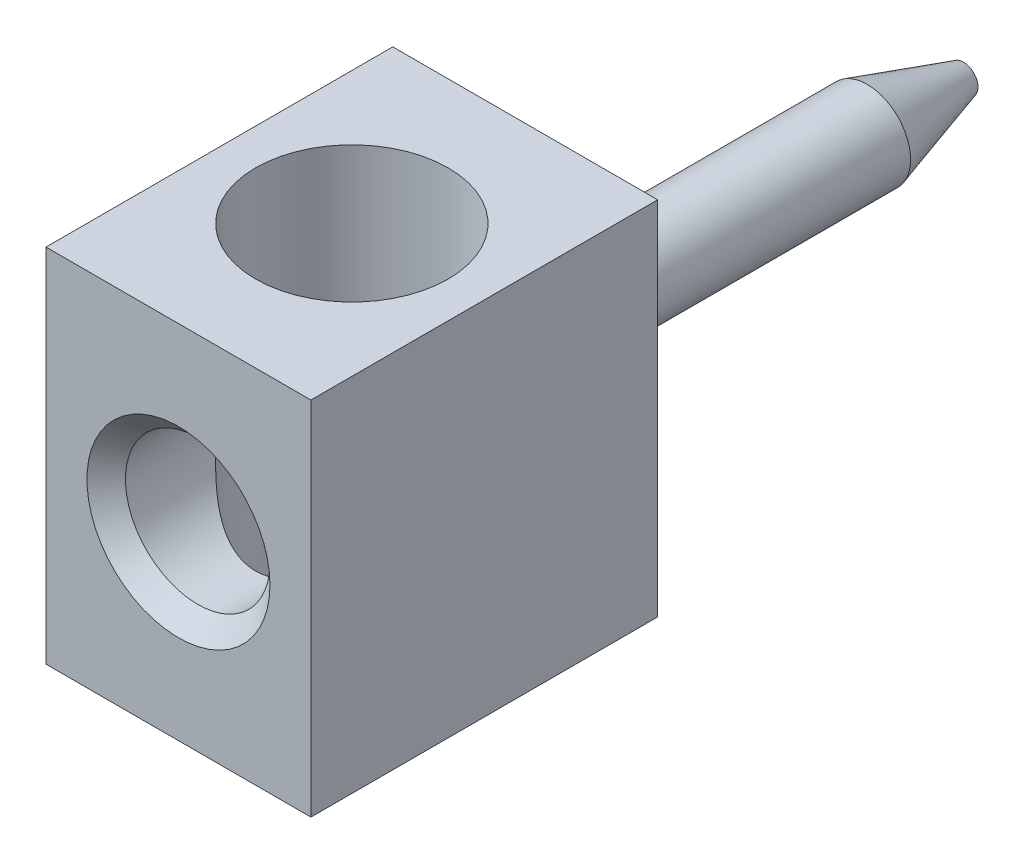
ISO-10303-21;
HEADER;
FILE_DESCRIPTION(('STEP AP214'),'2;1');
FILE_NAME('part.step','',(''),(''),'','','');
FILE_SCHEMA(('AUTOMOTIVE_DESIGN { 1 0 10303 214 1 1 1 1 }'));
ENDSEC;
DATA;
#1=APPLICATION_CONTEXT('core data for automotive mechanical design processes');
#2=APPLICATION_PROTOCOL_DEFINITION('international standard','automotive_design',2000,#1);
#3=PRODUCT_CONTEXT('',#1,'mechanical');
#4=PRODUCT('Part','Part','',(#3));
#5=PRODUCT_RELATED_PRODUCT_CATEGORY('part','',(#4));
#6=PRODUCT_DEFINITION_FORMATION('','',#4);
#7=PRODUCT_DEFINITION_CONTEXT('part definition',#1,'design');
#8=PRODUCT_DEFINITION('design','',#6,#7);
#9=PRODUCT_DEFINITION_SHAPE('','',#8);
#10=(LENGTH_UNIT() NAMED_UNIT(*) SI_UNIT(.MILLI.,.METRE.));
#11=(NAMED_UNIT(*) PLANE_ANGLE_UNIT() SI_UNIT($,.RADIAN.));
#12=(NAMED_UNIT(*) SI_UNIT($,.STERADIAN.) SOLID_ANGLE_UNIT());
#13=UNCERTAINTY_MEASURE_WITH_UNIT(LENGTH_MEASURE(1.E-05),#10,'distance_accuracy_value','');
#14=(GEOMETRIC_REPRESENTATION_CONTEXT(3) GLOBAL_UNCERTAINTY_ASSIGNED_CONTEXT((#13)) GLOBAL_UNIT_ASSIGNED_CONTEXT((#10,
#11,#12)) REPRESENTATION_CONTEXT('',''));
#15=CARTESIAN_POINT('',(0.,0.,0.));
#16=DIRECTION('',(0.,0.,1.));
#17=DIRECTION('',(1.,0.,0.));
#18=AXIS2_PLACEMENT_3D('',#15,#16,#17);
#19=CARTESIAN_POINT('',(0.,0.,-6.35));
#20=DIRECTION('',(0.,0.,1.));
#21=DIRECTION('',(1.,0.,0.));
#22=AXIS2_PLACEMENT_3D('',#19,#20,#21);
#23=PLANE('',#22);
#24=CARTESIAN_POINT('',(0.,0.,-6.34999999999764));
#25=DIRECTION('',(0.,0.,1.));
#26=DIRECTION('',(1.,0.,0.));
#27=AXIS2_PLACEMENT_3D('',#24,#25,#26);
#28=CIRCLE('',#27,0.149999999990768);
#29=CARTESIAN_POINT('',(0.149999999990768,0.,-6.34999999999764));
#30=VERTEX_POINT('',#29);
#31=EDGE_CURVE('E20',#30,#30,#28,.T.);
#32=ORIENTED_EDGE('',*,*,#31,.F.);
#33=EDGE_LOOP('',(#32));
#34=FACE_BOUND('',#33,.T.);
#35=ADVANCED_FACE('F17',(#34),#23,.F.);
#36=CARTESIAN_POINT('',(0.,0.,-5.35000000002128));
#37=DIRECTION('',(0.,0.,1.));
#38=DIRECTION('',(1.,0.,0.));
#39=AXIS2_PLACEMENT_3D('',#36,#37,#38);
#40=CONICAL_SURFACE('',#39,0.449999999972305,0.291456794467437);
#41=CARTESIAN_POINT('',(0.,0.,-5.35));
#42=DIRECTION('',(0.,0.,1.));
#43=DIRECTION('',(1.,0.,0.));
#44=AXIS2_PLACEMENT_3D('',#41,#42,#43);
#45=CIRCLE('',#44,0.45);
#46=CARTESIAN_POINT('',(0.449999999978691,0.,-5.35));
#47=VERTEX_POINT('',#46);
#48=EDGE_CURVE('E90',#47,#47,#45,.T.);
#49=CARTESIAN_POINT('',(0.449999999978691,0.,-5.35));
#50=CARTESIAN_POINT('',(0.446874999978817,0.,-5.36041666666664));
#51=CARTESIAN_POINT('',(0.443749999978942,0.,-5.37083333333328));
#52=CARTESIAN_POINT('',(0.437499999979194,0.,-5.39166666666657));
#53=CARTESIAN_POINT('',(0.43437499997932,0.,-5.40208333333321));
#54=CARTESIAN_POINT('',(0.428124999979571,0.,-5.42291666666649));
#55=CARTESIAN_POINT('',(0.424999999979697,0.,-5.43333333333314));
#56=CARTESIAN_POINT('',(0.418749999979949,0.,-5.45416666666642));
#57=CARTESIAN_POINT('',(0.415624999980075,0.,-5.46458333333306));
#58=CARTESIAN_POINT('',(0.409374999980326,0.,-5.48541666666635));
#59=CARTESIAN_POINT('',(0.406249999980452,0.,-5.49583333333299));
#60=CARTESIAN_POINT('',(0.399999999980704,0.,-5.51666666666627));
#61=CARTESIAN_POINT('',(0.396874999980829,0.,-5.52708333333291));
#62=CARTESIAN_POINT('',(0.390624999981081,0.,-5.5479166666662));
#63=CARTESIAN_POINT('',(0.387499999981207,0.,-5.55833333333284));
#64=CARTESIAN_POINT('',(0.381249999981459,0.,-5.57916666666612));
#65=CARTESIAN_POINT('',(0.378124999981584,0.,-5.58958333333277));
#66=CARTESIAN_POINT('',(0.371874999981836,0.,-5.61041666666605));
#67=CARTESIAN_POINT('',(0.368749999981962,0.,-5.62083333333269));
#68=CARTESIAN_POINT('',(0.362499999982213,0.,-5.64166666666598));
#69=CARTESIAN_POINT('',(0.359374999982339,0.,-5.65208333333262));
#70=CARTESIAN_POINT('',(0.353124999982591,0.,-5.6729166666659));
#71=CARTESIAN_POINT('',(0.349999999982717,0.,-5.68333333333254));
#72=CARTESIAN_POINT('',(0.343749999982968,0.,-5.70416666666583));
#73=CARTESIAN_POINT('',(0.340624999983094,0.,-5.71458333333247));
#74=CARTESIAN_POINT('',(0.334374999983346,0.,-5.73541666666575));
#75=CARTESIAN_POINT('',(0.331249999983471,0.,-5.7458333333324));
#76=CARTESIAN_POINT('',(0.324999999983723,0.,-5.76666666666568));
#77=CARTESIAN_POINT('',(0.321874999983849,0.,-5.77708333333232));
#78=CARTESIAN_POINT('',(0.315624999984101,0.,-5.79791666666561));
#79=CARTESIAN_POINT('',(0.312499999984226,0.,-5.80833333333225));
#80=CARTESIAN_POINT('',(0.306249999984478,0.,-5.82916666666553));
#81=CARTESIAN_POINT('',(0.303124999984604,0.,-5.83958333333218));
#82=CARTESIAN_POINT('',(0.296874999984855,0.,-5.86041666666546));
#83=CARTESIAN_POINT('',(0.293749999984981,0.,-5.8708333333321));
#84=CARTESIAN_POINT('',(0.287499999985233,0.,-5.89166666666539));
#85=CARTESIAN_POINT('',(0.284374999985359,0.,-5.90208333333203));
#86=CARTESIAN_POINT('',(0.27812499998561,0.,-5.92291666666531));
#87=CARTESIAN_POINT('',(0.274999999985736,0.,-5.93333333333195));
#88=CARTESIAN_POINT('',(0.268749999985988,0.,-5.95416666666524));
#89=CARTESIAN_POINT('',(0.265624999986113,0.,-5.96458333333188));
#90=CARTESIAN_POINT('',(0.259374999986365,0.,-5.98541666666516));
#91=CARTESIAN_POINT('',(0.256249999986491,0.,-5.99583333333181));
#92=CARTESIAN_POINT('',(0.249999999986743,0.,-6.01666666666509));
#93=CARTESIAN_POINT('',(0.246874999986868,0.,-6.02708333333173));
#94=CARTESIAN_POINT('',(0.24062499998712,0.,-6.04791666666502));
#95=CARTESIAN_POINT('',(0.237499999987246,0.,-6.05833333333166));
#96=CARTESIAN_POINT('',(0.231249999987497,0.,-6.07916666666494));
#97=CARTESIAN_POINT('',(0.228124999987623,0.,-6.08958333333158));
#98=CARTESIAN_POINT('',(0.221874999987875,0.,-6.11041666666487));
#99=CARTESIAN_POINT('',(0.218749999988001,0.,-6.12083333333151));
#100=CARTESIAN_POINT('',(0.212499999988252,0.,-6.1416666666648));
#101=CARTESIAN_POINT('',(0.209374999988378,0.,-6.15208333333144));
#102=CARTESIAN_POINT('',(0.20312499998863,0.,-6.17291666666472));
#103=CARTESIAN_POINT('',(0.199999999988755,0.,-6.18333333333136));
#104=CARTESIAN_POINT('',(0.193749999989007,0.,-6.20416666666465));
#105=CARTESIAN_POINT('',(0.190624999989133,0.,-6.21458333333129));
#106=CARTESIAN_POINT('',(0.184374999989385,0.,-6.23541666666457));
#107=CARTESIAN_POINT('',(0.18124999998951,0.,-6.24583333333122));
#108=CARTESIAN_POINT('',(0.174999999989762,0.,-6.2666666666645));
#109=CARTESIAN_POINT('',(0.171874999989888,0.,-6.27708333333114));
#110=CARTESIAN_POINT('',(0.165624999990139,0.,-6.29791666666443));
#111=CARTESIAN_POINT('',(0.162499999990265,0.,-6.30833333333107));
#112=CARTESIAN_POINT('',(0.156249999990517,0.,-6.32916666666435));
#113=CARTESIAN_POINT('',(0.153124999990643,0.,-6.33958333333099));
#114=CARTESIAN_POINT('',(0.149999999990768,0.,-6.34999999999764));
#115=B_SPLINE_CURVE_WITH_KNOTS('',3,(#49,#50,#51,#52,#53,#54,#55,#56,#57,#58,#59,#60,#61,#62,
#63,#64,#65,#66,#67,#68,#69,#70,#71,#72,#73,#74,#75,#76,#77,#78,#79,#80,#81,#82,#83,#84,#85,#86,
#87,#88,#89,#90,#91,#92,#93,#94,#95,#96,#97,#98,#99,#100,#101,#102,#103,#104,#105,#106,#107,
#108,#109,#110,#111,#112,#113,#114),.UNSPECIFIED.,.F.,.F.,(4,2,2,2,2,2,2,2,2,2,2,2,2,2,2,2,2,2,
2,2,2,2,2,2,2,2,2,2,2,2,2,2,4),(0.,0.0326259578401664,0.0652519156803329,0.0978778735204993,
0.130503831360666,0.163129789200832,0.195755747040998,0.228381704881164,0.261007662721331,
0.293633620561497,0.326259578401663,0.358885536241829,0.391511494081995,0.424137451922162,
0.456763409762328,0.489389367602495,0.522015325442661,0.554641283282827,0.587267241122993,
0.61989319896316,0.652519156803326,0.685145114643493,0.717771072483658,0.750397030323825,
0.783022988163991,0.815648946004157,0.848274903844324,0.880900861684489,0.913526819524656,
0.946152777364822,0.978778735204989,1.01140469304516,1.04403065088532),.UNSPECIFIED.);
#116=EDGE_CURVE('BSEAM133',#47,#30,#115,.T.);
#117=ORIENTED_EDGE('',*,*,#48,.F.);
#118=ORIENTED_EDGE('',*,*,#31,.T.);
#119=ORIENTED_EDGE('',*,*,#116,.T.);
#120=ORIENTED_EDGE('',*,*,#116,.F.);
#121=EDGE_LOOP('',(#117,#119,#118,#120));
#122=FACE_BOUND('',#121,.T.);
#123=ADVANCED_FACE('F133',(#122),#40,.T.);
#124=CARTESIAN_POINT('',(0.,0.,-6.35));
#125=DIRECTION('',(0.,0.,1.));
#126=DIRECTION('',(1.,0.,0.));
#127=AXIS2_PLACEMENT_3D('',#124,#125,#126);
#128=CYLINDRICAL_SURFACE('',#127,0.45);
#129=CARTESIAN_POINT('',(0.,0.,-1.8));
#130=DIRECTION('',(0.,0.,1.));
#131=DIRECTION('',(1.,0.,0.));
#132=AXIS2_PLACEMENT_3D('',#129,#130,#131);
#133=CIRCLE('',#132,0.45);
#134=CARTESIAN_POINT('',(0.45,0.,-1.8));
#135=VERTEX_POINT('',#134);
#136=EDGE_CURVE('E89',#135,#135,#133,.T.);
#137=ORIENTED_EDGE('',*,*,#136,.F.);
#138=EDGE_LOOP('',(#137));
#139=FACE_BOUND('',#138,.T.);
#140=ORIENTED_EDGE('',*,*,#48,.T.);
#141=EDGE_LOOP('',(#140));
#142=FACE_BOUND('',#141,.T.);
#143=ADVANCED_FACE('F129',(#139,#142),#128,.T.);
#144=CARTESIAN_POINT('',(1.375,-1.875,1.8));
#145=DIRECTION('',(1.,0.,0.));
#146=DIRECTION('',(0.,0.,-1.));
#147=AXIS2_PLACEMENT_3D('',#144,#145,#146);
#148=PLANE('',#147);
#149=DIRECTION('',(0.,0.,1.));
#150=VECTOR('',#149,1.);
#151=CARTESIAN_POINT('',(1.375,-1.875,0.));
#152=LINE('',#151,#150);
#153=CARTESIAN_POINT('',(1.375,-1.875,1.8));
#154=VERTEX_POINT('',#153);
#155=CARTESIAN_POINT('',(1.375,-1.875,-1.8));
#156=VERTEX_POINT('',#155);
#157=EDGE_CURVE('E300',#154,#156,#152,.F.);
#158=ORIENTED_EDGE('',*,*,#157,.T.);
#159=DIRECTION('',(0.,1.,0.));
#160=VECTOR('',#159,1.);
#161=CARTESIAN_POINT('',(1.375,-1.875,-1.8));
#162=LINE('',#161,#160);
#163=CARTESIAN_POINT('',(1.375,1.875,-1.8));
#164=VERTEX_POINT('',#163);
#165=EDGE_CURVE('E56',#164,#156,#162,.F.);
#166=ORIENTED_EDGE('',*,*,#165,.F.);
#167=DIRECTION('',(0.,0.,1.));
#168=VECTOR('',#167,1.);
#169=CARTESIAN_POINT('',(1.375,1.875,0.));
#170=LINE('',#169,#168);
#171=CARTESIAN_POINT('',(1.375,1.875,1.8));
#172=VERTEX_POINT('',#171);
#173=EDGE_CURVE('E301',#172,#164,#170,.F.);
#174=ORIENTED_EDGE('',*,*,#173,.F.);
#175=DIRECTION('',(0.,1.,0.));
#176=VECTOR('',#175,1.);
#177=CARTESIAN_POINT('',(1.375,-1.875,1.8));
#178=LINE('',#177,#176);
#179=EDGE_CURVE('E82',#154,#172,#178,.T.);
#180=ORIENTED_EDGE('',*,*,#179,.F.);
#181=EDGE_LOOP('',(#158,#166,#174,#180));
#182=FACE_BOUND('',#181,.T.);
#183=ADVANCED_FACE('F132',(#182),#148,.T.);
#184=CARTESIAN_POINT('',(1.375,-1.875,-1.8));
#185=DIRECTION('',(0.,0.,-1.));
#186=DIRECTION('',(-1.,0.,0.));
#187=AXIS2_PLACEMENT_3D('',#184,#185,#186);
#188=PLANE('',#187);
#189=DIRECTION('',(1.,0.,0.));
#190=VECTOR('',#189,1.);
#191=CARTESIAN_POINT('',(0.,-1.875,-1.8));
#192=LINE('',#191,#190);
#193=CARTESIAN_POINT('',(-1.375,-1.875,-1.8));
#194=VERTEX_POINT('',#193);
#195=EDGE_CURVE('E72',#156,#194,#192,.F.);
#196=ORIENTED_EDGE('',*,*,#195,.T.);
#197=DIRECTION('',(0.,1.,0.));
#198=VECTOR('',#197,1.);
#199=CARTESIAN_POINT('',(-1.375,-1.875,-1.8));
#200=LINE('',#199,#198);
#201=CARTESIAN_POINT('',(-1.375,1.875,-1.8));
#202=VERTEX_POINT('',#201);
#203=EDGE_CURVE('E62',#202,#194,#200,.F.);
#204=ORIENTED_EDGE('',*,*,#203,.F.);
#205=DIRECTION('',(1.,0.,0.));
#206=VECTOR('',#205,1.);
#207=CARTESIAN_POINT('',(0.,1.875,-1.8));
#208=LINE('',#207,#206);
#209=EDGE_CURVE('E305',#164,#202,#208,.F.);
#210=ORIENTED_EDGE('',*,*,#209,.F.);
#211=ORIENTED_EDGE('',*,*,#165,.T.);
#212=EDGE_LOOP('',(#196,#204,#210,#211));
#213=FACE_BOUND('',#212,.T.);
#214=ORIENTED_EDGE('',*,*,#136,.T.);
#215=EDGE_LOOP('',(#214));
#216=FACE_BOUND('',#215,.T.);
#217=ADVANCED_FACE('F77',(#213,#216),#188,.T.);
#218=CARTESIAN_POINT('',(-1.375,-1.875,-1.8));
#219=DIRECTION('',(-1.,0.,0.));
#220=DIRECTION('',(0.,0.,1.));
#221=AXIS2_PLACEMENT_3D('',#218,#219,#220);
#222=PLANE('',#221);
#223=DIRECTION('',(0.,0.,1.));
#224=VECTOR('',#223,1.);
#225=CARTESIAN_POINT('',(-1.375,-1.875,0.));
#226=LINE('',#225,#224);
#227=CARTESIAN_POINT('',(-1.375,-1.875,1.8));
#228=VERTEX_POINT('',#227);
#229=EDGE_CURVE('E65',#194,#228,#226,.T.);
#230=ORIENTED_EDGE('',*,*,#229,.T.);
#231=DIRECTION('',(0.,1.,0.));
#232=VECTOR('',#231,1.);
#233=CARTESIAN_POINT('',(-1.375,-1.875,1.8));
#234=LINE('',#233,#232);
#235=CARTESIAN_POINT('',(-1.375,1.875,1.8));
#236=VERTEX_POINT('',#235);
#237=EDGE_CURVE('E66',#236,#228,#234,.F.);
#238=ORIENTED_EDGE('',*,*,#237,.F.);
#239=DIRECTION('',(0.,0.,1.));
#240=VECTOR('',#239,1.);
#241=CARTESIAN_POINT('',(-1.375,1.875,0.));
#242=LINE('',#241,#240);
#243=EDGE_CURVE('E35',#202,#236,#242,.T.);
#244=ORIENTED_EDGE('',*,*,#243,.F.);
#245=ORIENTED_EDGE('',*,*,#203,.T.);
#246=EDGE_LOOP('',(#230,#238,#244,#245));
#247=FACE_BOUND('',#246,.T.);
#248=ADVANCED_FACE('F64',(#247),#222,.T.);
#249=CARTESIAN_POINT('',(-1.375,-1.875,1.8));
#250=DIRECTION('',(0.,0.,1.));
#251=DIRECTION('',(1.,0.,0.));
#252=AXIS2_PLACEMENT_3D('',#249,#250,#251);
#253=PLANE('',#252);
#254=DIRECTION('',(1.,0.,0.));
#255=VECTOR('',#254,1.);
#256=CARTESIAN_POINT('',(0.,-1.875,1.8));
#257=LINE('',#256,#255);
#258=EDGE_CURVE('E75',#228,#154,#257,.T.);
#259=ORIENTED_EDGE('',*,*,#258,.T.);
#260=ORIENTED_EDGE('',*,*,#179,.T.);
#261=DIRECTION('',(1.,0.,0.));
#262=VECTOR('',#261,1.);
#263=CARTESIAN_POINT('',(0.,1.875,1.8));
#264=LINE('',#263,#262);
#265=EDGE_CURVE('E124',#236,#172,#264,.T.);
#266=ORIENTED_EDGE('',*,*,#265,.F.);
#267=ORIENTED_EDGE('',*,*,#237,.T.);
#268=EDGE_LOOP('',(#259,#260,#266,#267));
#269=FACE_BOUND('',#268,.T.);
#270=CARTESIAN_POINT('',(0.,0.,1.80000000000291));
#271=DIRECTION('',(0.,0.,1.));
#272=DIRECTION('',(1.,0.,0.));
#273=AXIS2_PLACEMENT_3D('',#270,#271,#272);
#274=CIRCLE('',#273,0.949999999988904);
#275=CARTESIAN_POINT('',(0.949999999988903,0.,1.80000000000291));
#276=VERTEX_POINT('',#275);
#277=EDGE_CURVE('E79',#276,#276,#274,.F.);
#278=ORIENTED_EDGE('',*,*,#277,.T.);
#279=EDGE_LOOP('',(#278));
#280=FACE_BOUND('',#279,.T.);
#281=ADVANCED_FACE('F174',(#269,#280),#253,.T.);
#282=CARTESIAN_POINT('',(0.,0.,1.80000000000291));
#283=DIRECTION('',(0.,0.,1.));
#284=DIRECTION('',(1.,0.,0.));
#285=AXIS2_PLACEMENT_3D('',#282,#283,#284);
#286=CONICAL_SURFACE('',#285,0.949999999988905,0.785398163397448);
#287=ORIENTED_EDGE('',*,*,#277,.F.);
#288=EDGE_LOOP('',(#287));
#289=FACE_BOUND('',#288,.T.);
#290=CARTESIAN_POINT('',(0.,0.,1.6));
#291=DIRECTION('',(0.,0.,1.));
#292=DIRECTION('',(1.,0.,0.));
#293=AXIS2_PLACEMENT_3D('',#290,#291,#292);
#294=CIRCLE('',#293,0.75);
#295=CARTESIAN_POINT('',(0.749999999999999,0.,1.6));
#296=VERTEX_POINT('',#295);
#297=EDGE_CURVE('E122',#296,#296,#294,.F.);
#298=ORIENTED_EDGE('',*,*,#297,.T.);
#299=EDGE_LOOP('',(#298));
#300=FACE_BOUND('',#299,.T.);
#301=ADVANCED_FACE('F181',(#289,#300),#286,.F.);
#302=CARTESIAN_POINT('',(0.,-1.875,0.));
#303=DIRECTION('',(0.,1.,0.));
#304=DIRECTION('',(0.,0.,1.));
#305=AXIS2_PLACEMENT_3D('',#302,#303,#304);
#306=PLANE('',#305);
#307=CARTESIAN_POINT('',(0.,-1.875,0.));
#308=DIRECTION('',(0.,-1.,0.));
#309=DIRECTION('',(0.,0.,-1.));
#310=AXIS2_PLACEMENT_3D('',#307,#308,#309);
#311=CIRCLE('',#310,1.);
#312=CARTESIAN_POINT('',(0.,-1.875,-1.));
#313=VERTEX_POINT('',#312);
#314=EDGE_CURVE('E120',#313,#313,#311,.F.);
#315=ORIENTED_EDGE('',*,*,#314,.T.);
#316=EDGE_LOOP('',(#315));
#317=FACE_BOUND('',#316,.T.);
#318=ORIENTED_EDGE('',*,*,#258,.F.);
#319=ORIENTED_EDGE('',*,*,#229,.F.);
#320=ORIENTED_EDGE('',*,*,#195,.F.);
#321=ORIENTED_EDGE('',*,*,#157,.F.);
#322=EDGE_LOOP('',(#318,#319,#320,#321));
#323=FACE_BOUND('',#322,.T.);
#324=ADVANCED_FACE('F70',(#317,#323),#306,.F.);
#325=CARTESIAN_POINT('',(0.,1.875,0.));
#326=DIRECTION('',(0.,1.,0.));
#327=DIRECTION('',(0.,0.,1.));
#328=AXIS2_PLACEMENT_3D('',#325,#326,#327);
#329=PLANE('',#328);
#330=CARTESIAN_POINT('',(0.,1.875,0.));
#331=DIRECTION('',(0.,-1.,0.));
#332=DIRECTION('',(0.,0.,-1.));
#333=AXIS2_PLACEMENT_3D('',#330,#331,#332);
#334=CIRCLE('',#333,1.);
#335=CARTESIAN_POINT('',(0.,1.875,-1.));
#336=VERTEX_POINT('',#335);
#337=EDGE_CURVE('E26',#336,#336,#334,.T.);
#338=ORIENTED_EDGE('',*,*,#337,.T.);
#339=EDGE_LOOP('',(#338));
#340=FACE_BOUND('',#339,.T.);
#341=ORIENTED_EDGE('',*,*,#243,.T.);
#342=ORIENTED_EDGE('',*,*,#265,.T.);
#343=ORIENTED_EDGE('',*,*,#173,.T.);
#344=ORIENTED_EDGE('',*,*,#209,.T.);
#345=EDGE_LOOP('',(#341,#342,#343,#344));
#346=FACE_BOUND('',#345,.T.);
#347=ADVANCED_FACE('F111',(#340,#346),#329,.T.);
#348=CARTESIAN_POINT('',(0.,0.,-7.583362936602));
#349=DIRECTION('',(0.,0.,1.));
#350=DIRECTION('',(1.,0.,0.));
#351=AXIS2_PLACEMENT_3D('',#348,#349,#350);
#352=CYLINDRICAL_SURFACE('',#351,0.75);
#353=CARTESIAN_POINT('',(0.749883848426441,0.0131990101579515,0.661569507965074));
#354=CARTESIAN_POINT('',(0.750484620605992,-0.0211968194496873,0.660892931706871));
#355=CARTESIAN_POINT('',(0.748699929914007,-0.0557334692623203,0.662941130820464));
#356=CARTESIAN_POINT('',(0.740540882571068,-0.123603785281289,0.672035188662263));
#357=CARTESIAN_POINT('',(0.734153955631906,-0.15693389359248,0.67909473431332));
#358=CARTESIAN_POINT('',(0.717443666832934,-0.22104030332036,0.696719362761739));
#359=CARTESIAN_POINT('',(0.707174872556707,-0.251845111908803,0.707235598792608));
#360=CARTESIAN_POINT('',(0.683154994254588,-0.311167200301614,0.730464948036215));
#361=CARTESIAN_POINT('',(0.669400951101563,-0.33968250899271,0.74317992514727));
#362=CARTESIAN_POINT('',(0.631480166359183,-0.407263319781624,0.775963669234049));
#363=CARTESIAN_POINT('',(0.605458824601718,-0.444981286719573,0.79667797113095));
#364=CARTESIAN_POINT('',(0.546969765201353,-0.51517929541006,0.837919333759926));
#365=CARTESIAN_POINT('',(0.514499010948226,-0.547656856690569,0.858446301508438));
#366=CARTESIAN_POINT('',(0.449045840497022,-0.601967525048385,0.894158178218174));
#367=CARTESIAN_POINT('',(0.416969497473157,-0.624672142722385,0.909673111634799));
#368=CARTESIAN_POINT('',(0.348763537796028,-0.665154564629891,0.937934242581555));
#369=CARTESIAN_POINT('',(0.312640912355975,-0.682940688089369,0.950685107310208));
#370=CARTESIAN_POINT('',(0.242839611255994,-0.710429617042206,0.970636845563495));
#371=CARTESIAN_POINT('',(0.209645430905922,-0.72095668531951,0.978390794897017));
#372=CARTESIAN_POINT('',(0.141527433546013,-0.737356594327651,0.990537243919042));
#373=CARTESIAN_POINT('',(0.106604489834923,-0.743231760019587,0.994931422739883));
#374=CARTESIAN_POINT('',(0.0358956776682133,-0.749984135655339,0.999985545592139));
#375=CARTESIAN_POINT('',(0.00010751332576501,-0.750846133562292,1.00063412387152));
#376=CARTESIAN_POINT('',(-0.0710903684362527,-0.74747340322806,0.998105837792369));
#377=CARTESIAN_POINT('',(-0.106500054079123,-0.743238250374008,0.994928654732745));
#378=CARTESIAN_POINT('',(-0.174212847998501,-0.730261982195053,0.985274076690176));
#379=CARTESIAN_POINT('',(-0.206583590455102,-0.721745113841322,0.978961093318626));
#380=CARTESIAN_POINT('',(-0.269316438515805,-0.70075942496311,0.963593709758754));
#381=CARTESIAN_POINT('',(-0.299678096567382,-0.688289727447349,0.954538701233171));
#382=CARTESIAN_POINT('',(-0.360776545649748,-0.658487827437458,0.933266575230174));
#383=CARTESIAN_POINT('',(-0.391260901163832,-0.640799901917096,0.920827134320275));
#384=CARTESIAN_POINT('',(-0.44893746193595,-0.60180490783499,0.894129259999149));
#385=CARTESIAN_POINT('',(-0.476127222903832,-0.580495180046393,0.879869491982436));
#386=CARTESIAN_POINT('',(-0.531986566638907,-0.53024830190689,0.847480697518544));
#387=CARTESIAN_POINT('',(-0.55992205748266,-0.50063329463528,0.829137324217252));
#388=CARTESIAN_POINT('',(-0.610701896503626,-0.437257722982544,0.792479016548525));
#389=CARTESIAN_POINT('',(-0.633542489076695,-0.403494128796369,0.774164112977311));
#390=CARTESIAN_POINT('',(-0.670643843539718,-0.337544936617878,0.742119174626266));
#391=CARTESIAN_POINT('',(-0.685686812600208,-0.305932404206801,0.728119305440613));
#392=CARTESIAN_POINT('',(-0.711458971007102,-0.239946411863035,0.702958490103216));
#393=CARTESIAN_POINT('',(-0.722197679179774,-0.205579248174367,0.691791299834323));
#394=CARTESIAN_POINT('',(-0.736919672578217,-0.142331029643415,0.676047431024269));
#395=CARTESIAN_POINT('',(-0.741869726663157,-0.113907966490128,0.670561060007167));
#396=CARTESIAN_POINT('',(-0.748449756656191,-0.056232697204073,0.663210971932768));
#397=CARTESIAN_POINT('',(-0.750084581274434,-0.0269817655037957,0.66134196445995));
#398=CARTESIAN_POINT('',(-0.74990848520074,0.0315427736605609,0.661541552841743));
#399=CARTESIAN_POINT('',(-0.748092019816684,0.060816341960258,0.663616484859793));
#400=CARTESIAN_POINT('',(-0.741152049961772,0.118493749438525,0.671356210052281));
#401=CARTESIAN_POINT('',(-0.736023663579716,0.146896239767203,0.67702630241991));
#402=CARTESIAN_POINT('',(-0.720576138591379,0.21144259711475,0.693494117182024));
#403=CARTESIAN_POINT('',(-0.709099217208241,0.247027680383507,0.70536902202864));
#404=CARTESIAN_POINT('',(-0.681540258712221,0.31521949166255,0.732032052000989));
#405=CARTESIAN_POINT('',(-0.665445373641088,0.347817570766963,0.746828268385603));
#406=CARTESIAN_POINT('',(-0.623957565932579,0.418696240171715,0.782055189630959));
#407=CARTESIAN_POINT('',(-0.597222533905636,0.455987403557838,0.802898258651641));
#408=CARTESIAN_POINT('',(-0.53733506630861,0.525225650321059,0.844153364141449));
#409=CARTESIAN_POINT('',(-0.504187778604677,0.557176982505119,0.864565731902083));
#410=CARTESIAN_POINT('',(-0.437940390466575,0.610066984142204,0.89964611257628));
#411=CARTESIAN_POINT('',(-0.40580496026,0.631954553256747,0.914699149379374));
#412=CARTESIAN_POINT('',(-0.337613311132958,0.670861350125607,0.941999339393945));
#413=CARTESIAN_POINT('',(-0.301559995807107,0.687884149715665,0.95424854992286));
#414=CARTESIAN_POINT('',(-0.225841046095804,0.71634098809236,0.974960673895972));
#415=CARTESIAN_POINT('',(-0.186145105244136,0.727721919769779,0.98338754690695));
#416=CARTESIAN_POINT('',(-0.104716375441365,0.743807765295297,0.995349327167658));
#417=CARTESIAN_POINT('',(-0.0629860388178879,0.74852052094228,0.998889980508133));
#418=CARTESIAN_POINT('',(0.0143166300799724,0.750703092817858,1.00052770246399));
#419=CARTESIAN_POINT('',(0.0498494262187417,0.749174987143045,0.999377935275147));
#420=CARTESIAN_POINT('',(0.120031386835766,0.741174136186135,0.993394131332221));
#421=CARTESIAN_POINT('',(0.154680560182222,0.734701440549056,0.98856013156883));
#422=CARTESIAN_POINT('',(0.221042749159607,0.717480761673536,0.975831145860761));
#423=CARTESIAN_POINT('',(0.252814592378815,0.706878566542814,0.968040751096225));
#424=CARTESIAN_POINT('',(0.314048802533679,0.681885593386466,0.949944100741972));
#425=CARTESIAN_POINT('',(0.343510783101161,0.667494183290197,0.939637425437903));
#426=CARTESIAN_POINT('',(0.403417525861155,0.63331937022871,0.915655952730386));
#427=CARTESIAN_POINT('',(0.433494359271019,0.613078773342748,0.901717712307339));
#428=CARTESIAN_POINT('',(0.490005481822072,0.568931399323668,0.872302594266606));
#429=CARTESIAN_POINT('',(0.516435366418244,0.545020261483082,0.856823894334031));
#430=CARTESIAN_POINT('',(0.570410109342627,0.488816233095494,0.822104415962968));
#431=CARTESIAN_POINT('',(0.597121028042012,0.45580340489445,0.802730302776776));
#432=CARTESIAN_POINT('',(0.644831452933646,0.385358907120341,0.764928472636655));
#433=CARTESIAN_POINT('',(0.665832015057592,0.34792805634509,0.746500581223861));
#434=CARTESIAN_POINT('',(0.696536649777014,0.279845669674793,0.717738777115214));
#435=CARTESIAN_POINT('',(0.707757387775361,0.250227654474832,0.706582850334457));
#436=CARTESIAN_POINT('',(0.726510522112855,0.188948394149885,0.687287858634668));
#437=CARTESIAN_POINT('',(0.734054739107276,0.157294072725471,0.679139145788037));
#438=CARTESIAN_POINT('',(0.7426122587634,0.106635022009736,0.669737189486707));
#439=CARTESIAN_POINT('',(0.745038918593136,0.0881311604331452,0.667026541296402));
#440=CARTESIAN_POINT('',(0.748510292976267,0.0508319744008598,0.663127869435883));
#441=CARTESIAN_POINT('',(0.749554822877451,0.0320366113399353,0.661940049215762));
#442=CARTESIAN_POINT('',(0.749883848426441,0.0131990101579515,0.661569507965074));
#443=B_SPLINE_CURVE_WITH_KNOTS('',3,(#353,#354,#355,#356,#357,#358,#359,#360,#361,#362,#363,
#364,#365,#366,#367,#368,#369,#370,#371,#372,#373,#374,#375,#376,#377,#378,#379,#380,#381,#382,
#383,#384,#385,#386,#387,#388,#389,#390,#391,#392,#393,#394,#395,#396,#397,#398,#399,#400,#401,
#402,#403,#404,#405,#406,#407,#408,#409,#410,#411,#412,#413,#414,#415,#416,#417,#418,#419,#420,
#421,#422,#423,#424,#425,#426,#427,#428,#429,#430,#431,#432,#433,#434,#435,#436,#437,#438,#439,
#440,#441,#442),.UNSPECIFIED.,.T.,.F.,(4,2,2,2,2,2,2,2,2,2,2,2,2,2,2,2,2,2,2,2,2,2,2,2,2,2,2,2,
2,2,2,2,2,2,2,2,2,2,2,2,2,2,2,2,4),(0.,0.103125151998051,0.206533047098524,0.308538350217507,
0.410630552151913,0.560750614495443,0.710941526914991,0.837199120085586,0.963241834279635,
1.0698134151033,1.1763316991415,1.28317303601358,1.39002327380874,1.49178379863479,
1.59356691629853,1.70528096037634,1.81707738514928,1.95053596284161,2.08409259417608,
2.19685078178215,2.30935821149834,2.39709574468049,2.48470486395193,2.57245485123754,
2.66033448185522,2.77737658628864,2.89474753279139,3.04521307051893,3.19555830958221,
3.32014821710055,3.44464641117223,3.57029525523714,3.69579621264902,3.8020039693178,
3.90821065964602,4.01096553130996,4.1137375541597,4.2298357664058,4.34607298963001,
4.48555444915384,4.62501009886934,4.72544620490075,4.82555722519823,4.88202834490203,
4.93850700837173),.UNSPECIFIED.);
#444=CARTESIAN_POINT('',(0.749883848426441,0.0131990101579515,0.661569507965074));
#445=VERTEX_POINT('',#444);
#446=EDGE_CURVE('E11',#445,#445,#443,.T.);
#447=ORIENTED_EDGE('',*,*,#446,.T.);
#448=EDGE_LOOP('',(#447));
#449=FACE_BOUND('',#448,.T.);
#450=ORIENTED_EDGE('',*,*,#297,.F.);
#451=EDGE_LOOP('',(#450));
#452=FACE_BOUND('',#451,.T.);
#453=ADVANCED_FACE('F99',(#449,#452),#352,.F.);
#454=CARTESIAN_POINT('',(0.,7.508362936602,0.));
#455=DIRECTION('',(0.,-1.,0.));
#456=DIRECTION('',(0.,0.,-1.));
#457=AXIS2_PLACEMENT_3D('',#454,#455,#456);
#458=CYLINDRICAL_SURFACE('',#457,1.);
#459=ORIENTED_EDGE('',*,*,#337,.F.);
#460=EDGE_LOOP('',(#459));
#461=FACE_BOUND('',#460,.T.);
#462=ORIENTED_EDGE('',*,*,#446,.F.);
#463=EDGE_LOOP('',(#462));
#464=FACE_BOUND('',#463,.T.);
#465=ORIENTED_EDGE('',*,*,#314,.F.);
#466=EDGE_LOOP('',(#465));
#467=FACE_BOUND('',#466,.T.);
#468=ADVANCED_FACE('F102',(#461,#464,#467),#458,.F.);
#469=CLOSED_SHELL('',(#35,#123,#143,#183,#217,#248,#281,#301,#324,#347,#453,#468));
#470=MANIFOLD_SOLID_BREP('B1',#469);
#471=ADVANCED_BREP_SHAPE_REPRESENTATION('',(#18,#470),#14);
#472=SHAPE_DEFINITION_REPRESENTATION(#9,#471);
ENDSEC;
END-ISO-10303-21;
